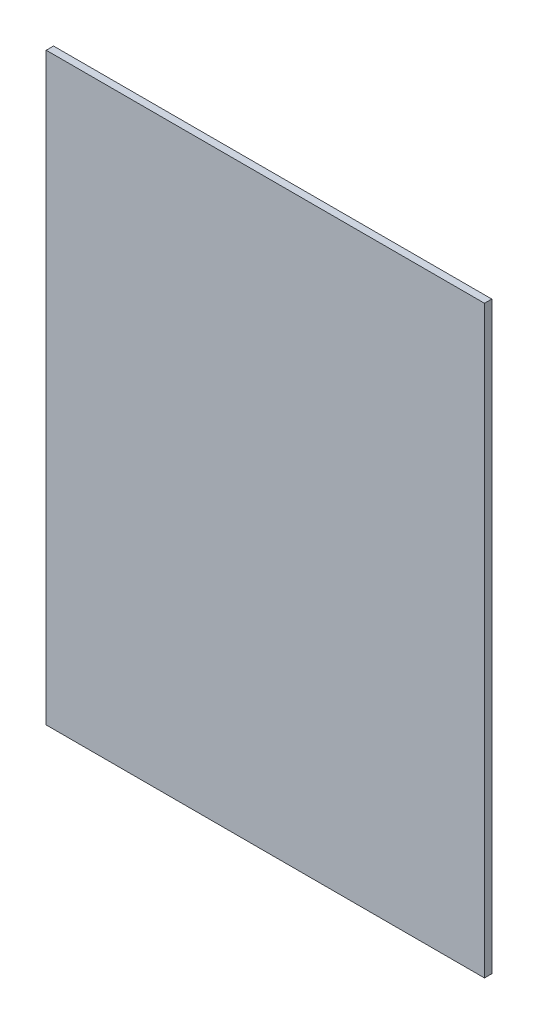
ISO-10303-21;
HEADER;
FILE_DESCRIPTION(('STEP AP214'),'2;1');
FILE_NAME('part.step','',(''),(''),'','','');
FILE_SCHEMA(('AUTOMOTIVE_DESIGN { 1 0 10303 214 1 1 1 1 }'));
ENDSEC;
DATA;
#1=APPLICATION_CONTEXT('core data for automotive mechanical design processes');
#2=APPLICATION_PROTOCOL_DEFINITION('international standard','automotive_design',2000,#1);
#3=PRODUCT_CONTEXT('',#1,'mechanical');
#4=PRODUCT('Part','Part','',(#3));
#5=PRODUCT_RELATED_PRODUCT_CATEGORY('part','',(#4));
#6=PRODUCT_DEFINITION_FORMATION('','',#4);
#7=PRODUCT_DEFINITION_CONTEXT('part definition',#1,'design');
#8=PRODUCT_DEFINITION('design','',#6,#7);
#9=PRODUCT_DEFINITION_SHAPE('','',#8);
#10=(LENGTH_UNIT() NAMED_UNIT(*) SI_UNIT(.MILLI.,.METRE.));
#11=(NAMED_UNIT(*) PLANE_ANGLE_UNIT() SI_UNIT($,.RADIAN.));
#12=(NAMED_UNIT(*) SI_UNIT($,.STERADIAN.) SOLID_ANGLE_UNIT());
#13=UNCERTAINTY_MEASURE_WITH_UNIT(LENGTH_MEASURE(1.E-05),#10,'distance_accuracy_value','');
#14=(GEOMETRIC_REPRESENTATION_CONTEXT(3) GLOBAL_UNCERTAINTY_ASSIGNED_CONTEXT((#13)) GLOBAL_UNIT_ASSIGNED_CONTEXT((#10,
#11,#12)) REPRESENTATION_CONTEXT('',''));
#15=CARTESIAN_POINT('',(0.,0.,0.));
#16=DIRECTION('',(0.,0.,1.));
#17=DIRECTION('',(1.,0.,0.));
#18=AXIS2_PLACEMENT_3D('',#15,#16,#17);
#19=CARTESIAN_POINT('',(0.,0.,5.08));
#20=DIRECTION('',(1.,0.,0.));
#21=DIRECTION('',(0.,0.,-1.));
#22=AXIS2_PLACEMENT_3D('',#19,#20,#21);
#23=PLANE('',#22);
#24=DIRECTION('',(0.,-1.,0.));
#25=VECTOR('',#24,1.);
#26=CARTESIAN_POINT('',(0.,0.,0.));
#27=LINE('',#26,#25);
#28=CARTESIAN_POINT('',(0.,406.4,0.));
#29=VERTEX_POINT('',#28);
#30=CARTESIAN_POINT('',(0.,0.,0.));
#31=VERTEX_POINT('',#30);
#32=EDGE_CURVE('E99',#29,#31,#27,.T.);
#33=ORIENTED_EDGE('',*,*,#32,.T.);
#34=DIRECTION('',(0.,0.,-1.));
#35=VECTOR('',#34,1.);
#36=CARTESIAN_POINT('',(0.,0.,5.08));
#37=LINE('',#36,#35);
#38=CARTESIAN_POINT('',(0.,0.,5.08));
#39=VERTEX_POINT('',#38);
#40=EDGE_CURVE('E11',#39,#31,#37,.T.);
#41=ORIENTED_EDGE('',*,*,#40,.F.);
#42=DIRECTION('',(0.,-1.,0.));
#43=VECTOR('',#42,1.);
#44=CARTESIAN_POINT('',(0.,0.,5.08));
#45=LINE('',#44,#43);
#46=CARTESIAN_POINT('',(0.,406.4,5.08));
#47=VERTEX_POINT('',#46);
#48=EDGE_CURVE('E87',#47,#39,#45,.T.);
#49=ORIENTED_EDGE('',*,*,#48,.F.);
#50=DIRECTION('',(0.,0.,-1.));
#51=VECTOR('',#50,1.);
#52=CARTESIAN_POINT('',(0.,406.4,5.08));
#53=LINE('',#52,#51);
#54=EDGE_CURVE('E95',#47,#29,#53,.T.);
#55=ORIENTED_EDGE('',*,*,#54,.T.);
#56=EDGE_LOOP('',(#33,#41,#49,#55));
#57=FACE_BOUND('',#56,.T.);
#58=ADVANCED_FACE('F36',(#57),#23,.F.);
#59=CARTESIAN_POINT('',(0.,0.,5.08));
#60=DIRECTION('',(0.,1.,0.));
#61=DIRECTION('',(0.,0.,1.));
#62=AXIS2_PLACEMENT_3D('',#59,#60,#61);
#63=PLANE('',#62);
#64=DIRECTION('',(1.,0.,0.));
#65=VECTOR('',#64,1.);
#66=CARTESIAN_POINT('',(0.,0.,0.));
#67=LINE('',#66,#65);
#68=CARTESIAN_POINT('',(304.8,0.,0.));
#69=VERTEX_POINT('',#68);
#70=EDGE_CURVE('E91',#31,#69,#67,.T.);
#71=ORIENTED_EDGE('',*,*,#70,.T.);
#72=DIRECTION('',(0.,0.,-1.));
#73=VECTOR('',#72,1.);
#74=CARTESIAN_POINT('',(304.8,0.,5.08));
#75=LINE('',#74,#73);
#76=CARTESIAN_POINT('',(304.8,0.,5.08));
#77=VERTEX_POINT('',#76);
#78=EDGE_CURVE('E44',#77,#69,#75,.T.);
#79=ORIENTED_EDGE('',*,*,#78,.F.);
#80=DIRECTION('',(1.,0.,0.));
#81=VECTOR('',#80,1.);
#82=CARTESIAN_POINT('',(0.,0.,5.08));
#83=LINE('',#82,#81);
#84=EDGE_CURVE('E82',#39,#77,#83,.T.);
#85=ORIENTED_EDGE('',*,*,#84,.F.);
#86=ORIENTED_EDGE('',*,*,#40,.T.);
#87=EDGE_LOOP('',(#71,#79,#85,#86));
#88=FACE_BOUND('',#87,.T.);
#89=ADVANCED_FACE('F90',(#88),#63,.F.);
#90=CARTESIAN_POINT('',(304.8,0.,5.08));
#91=DIRECTION('',(-1.,0.,0.));
#92=DIRECTION('',(0.,0.,1.));
#93=AXIS2_PLACEMENT_3D('',#90,#91,#92);
#94=PLANE('',#93);
#95=DIRECTION('',(0.,1.,0.));
#96=VECTOR('',#95,1.);
#97=CARTESIAN_POINT('',(304.8,0.,0.));
#98=LINE('',#97,#96);
#99=CARTESIAN_POINT('',(304.8,406.4,0.));
#100=VERTEX_POINT('',#99);
#101=EDGE_CURVE('E69',#69,#100,#98,.T.);
#102=ORIENTED_EDGE('',*,*,#101,.T.);
#103=DIRECTION('',(0.,0.,-1.));
#104=VECTOR('',#103,1.);
#105=CARTESIAN_POINT('',(304.8,406.4,5.08));
#106=LINE('',#105,#104);
#107=CARTESIAN_POINT('',(304.8,406.4,5.08));
#108=VERTEX_POINT('',#107);
#109=EDGE_CURVE('E92',#108,#100,#106,.T.);
#110=ORIENTED_EDGE('',*,*,#109,.F.);
#111=DIRECTION('',(0.,1.,0.));
#112=VECTOR('',#111,1.);
#113=CARTESIAN_POINT('',(304.8,0.,5.08));
#114=LINE('',#113,#112);
#115=EDGE_CURVE('E85',#77,#108,#114,.T.);
#116=ORIENTED_EDGE('',*,*,#115,.F.);
#117=ORIENTED_EDGE('',*,*,#78,.T.);
#118=EDGE_LOOP('',(#102,#110,#116,#117));
#119=FACE_BOUND('',#118,.T.);
#120=ADVANCED_FACE('F93',(#119),#94,.F.);
#121=CARTESIAN_POINT('',(0.,406.4,5.08));
#122=DIRECTION('',(0.,-1.,0.));
#123=DIRECTION('',(0.,0.,-1.));
#124=AXIS2_PLACEMENT_3D('',#121,#122,#123);
#125=PLANE('',#124);
#126=DIRECTION('',(-1.,0.,0.));
#127=VECTOR('',#126,1.);
#128=CARTESIAN_POINT('',(0.,406.4,0.));
#129=LINE('',#128,#127);
#130=EDGE_CURVE('E75',#100,#29,#129,.T.);
#131=ORIENTED_EDGE('',*,*,#130,.T.);
#132=ORIENTED_EDGE('',*,*,#54,.F.);
#133=DIRECTION('',(-1.,0.,0.));
#134=VECTOR('',#133,1.);
#135=CARTESIAN_POINT('',(0.,406.4,5.08));
#136=LINE('',#135,#134);
#137=EDGE_CURVE('E52',#108,#47,#136,.T.);
#138=ORIENTED_EDGE('',*,*,#137,.F.);
#139=ORIENTED_EDGE('',*,*,#109,.T.);
#140=EDGE_LOOP('',(#131,#132,#138,#139));
#141=FACE_BOUND('',#140,.T.);
#142=ADVANCED_FACE('F106',(#141),#125,.F.);
#143=CARTESIAN_POINT('',(0.,0.,5.08));
#144=DIRECTION('',(0.,0.,-1.));
#145=DIRECTION('',(-1.,0.,0.));
#146=AXIS2_PLACEMENT_3D('',#143,#144,#145);
#147=PLANE('',#146);
#148=ORIENTED_EDGE('',*,*,#48,.T.);
#149=ORIENTED_EDGE('',*,*,#84,.T.);
#150=ORIENTED_EDGE('',*,*,#115,.T.);
#151=ORIENTED_EDGE('',*,*,#137,.T.);
#152=EDGE_LOOP('',(#148,#149,#150,#151));
#153=FACE_BOUND('',#152,.T.);
#154=ADVANCED_FACE('F83',(#153),#147,.F.);
#155=CARTESIAN_POINT('',(0.,0.,0.));
#156=DIRECTION('',(0.,0.,-1.));
#157=DIRECTION('',(-1.,0.,0.));
#158=AXIS2_PLACEMENT_3D('',#155,#156,#157);
#159=PLANE('',#158);
#160=ORIENTED_EDGE('',*,*,#32,.F.);
#161=ORIENTED_EDGE('',*,*,#130,.F.);
#162=ORIENTED_EDGE('',*,*,#101,.F.);
#163=ORIENTED_EDGE('',*,*,#70,.F.);
#164=EDGE_LOOP('',(#160,#161,#162,#163));
#165=FACE_BOUND('',#164,.T.);
#166=ADVANCED_FACE('F109',(#165),#159,.T.);
#167=CLOSED_SHELL('',(#58,#89,#120,#142,#154,#166));
#168=MANIFOLD_SOLID_BREP('B2',#167);
#169=ADVANCED_BREP_SHAPE_REPRESENTATION('',(#18,#168),#14);
#170=SHAPE_DEFINITION_REPRESENTATION(#9,#169);
ENDSEC;
END-ISO-10303-21;
